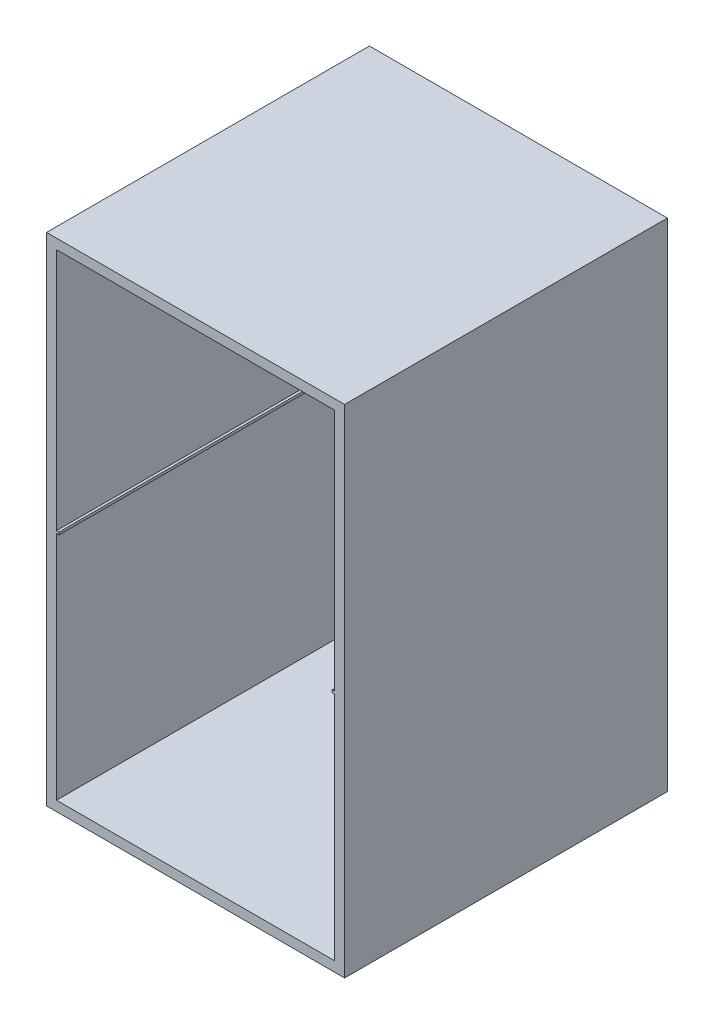
ISO-10303-21;
HEADER;
FILE_DESCRIPTION(('STEP AP214'),'2;1');
FILE_NAME('part.step','',(''),(''),'','','');
FILE_SCHEMA(('AUTOMOTIVE_DESIGN { 1 0 10303 214 1 1 1 1 }'));
ENDSEC;
DATA;
#1=APPLICATION_CONTEXT('core data for automotive mechanical design processes');
#2=APPLICATION_PROTOCOL_DEFINITION('international standard','automotive_design',2000,#1);
#3=PRODUCT_CONTEXT('',#1,'mechanical');
#4=PRODUCT('Part','Part','',(#3));
#5=PRODUCT_RELATED_PRODUCT_CATEGORY('part','',(#4));
#6=PRODUCT_DEFINITION_FORMATION('','',#4);
#7=PRODUCT_DEFINITION_CONTEXT('part definition',#1,'design');
#8=PRODUCT_DEFINITION('design','',#6,#7);
#9=PRODUCT_DEFINITION_SHAPE('','',#8);
#10=(LENGTH_UNIT() NAMED_UNIT(*) SI_UNIT(.MILLI.,.METRE.));
#11=(NAMED_UNIT(*) PLANE_ANGLE_UNIT() SI_UNIT($,.RADIAN.));
#12=(NAMED_UNIT(*) SI_UNIT($,.STERADIAN.) SOLID_ANGLE_UNIT());
#13=UNCERTAINTY_MEASURE_WITH_UNIT(LENGTH_MEASURE(1.E-05),#10,'distance_accuracy_value','');
#14=(GEOMETRIC_REPRESENTATION_CONTEXT(3) GLOBAL_UNCERTAINTY_ASSIGNED_CONTEXT((#13)) GLOBAL_UNIT_ASSIGNED_CONTEXT((#10,
#11,#12)) REPRESENTATION_CONTEXT('',''));
#15=CARTESIAN_POINT('',(0.,0.,0.));
#16=DIRECTION('',(0.,0.,1.));
#17=DIRECTION('',(1.,0.,0.));
#18=AXIS2_PLACEMENT_3D('',#15,#16,#17);
#19=CARTESIAN_POINT('',(280.,-500.,650.));
#20=DIRECTION('',(-1.,0.,0.));
#21=DIRECTION('',(0.,0.,1.));
#22=AXIS2_PLACEMENT_3D('',#19,#20,#21);
#23=PLANE('',#22);
#24=DIRECTION('',(0.,1.,0.));
#25=VECTOR('',#24,1.);
#26=CARTESIAN_POINT('',(280.,-500.,650.));
#27=LINE('',#26,#25);
#28=CARTESIAN_POINT('',(280.,-480.,650.));
#29=VERTEX_POINT('',#28);
#30=CARTESIAN_POINT('',(280.,-15.0000000000001,650.));
#31=VERTEX_POINT('',#30);
#32=EDGE_CURVE('E58',#29,#31,#27,.T.);
#33=ORIENTED_EDGE('',*,*,#32,.T.);
#34=DIRECTION('',(0.,0.,1.));
#35=VECTOR('',#34,1.);
#36=CARTESIAN_POINT('',(280.,-15.,-0.00199999999994649));
#37=LINE('',#36,#35);
#38=CARTESIAN_POINT('',(280.,-15.0000000000001,20.));
#39=VERTEX_POINT('',#38);
#40=EDGE_CURVE('E172',#39,#31,#37,.T.);
#41=ORIENTED_EDGE('',*,*,#40,.F.);
#42=DIRECTION('',(0.,1.,0.));
#43=VECTOR('',#42,1.);
#44=CARTESIAN_POINT('',(280.,-500.,20.));
#45=LINE('',#44,#43);
#46=CARTESIAN_POINT('',(280.,-480.,20.));
#47=VERTEX_POINT('',#46);
#48=EDGE_CURVE('E227',#47,#39,#45,.T.);
#49=ORIENTED_EDGE('',*,*,#48,.F.);
#50=DIRECTION('',(0.,0.,-1.));
#51=VECTOR('',#50,1.);
#52=CARTESIAN_POINT('',(280.,-480.,650.));
#53=LINE('',#52,#51);
#54=EDGE_CURVE('E217',#29,#47,#53,.T.);
#55=ORIENTED_EDGE('',*,*,#54,.F.);
#56=EDGE_LOOP('',(#33,#41,#49,#55));
#57=FACE_BOUND('',#56,.T.);
#58=ADVANCED_FACE('F35',(#57),#23,.T.);
#59=CARTESIAN_POINT('',(0.,0.,20.));
#60=DIRECTION('',(0.,0.,1.));
#61=DIRECTION('',(1.,0.,0.));
#62=AXIS2_PLACEMENT_3D('',#59,#60,#61);
#63=PLANE('',#62);
#64=ORIENTED_EDGE('',*,*,#48,.T.);
#65=DIRECTION('',(1.,0.,0.));
#66=VECTOR('',#65,1.);
#67=CARTESIAN_POINT('',(0.,-15.0000000000002,20.));
#68=LINE('',#67,#66);
#69=CARTESIAN_POINT('',(275.,-15.,20.));
#70=VERTEX_POINT('',#69);
#71=EDGE_CURVE('E155',#70,#39,#68,.T.);
#72=ORIENTED_EDGE('',*,*,#71,.F.);
#73=DIRECTION('',(0.,1.,0.));
#74=VECTOR('',#73,1.);
#75=CARTESIAN_POINT('',(275.,0.,20.));
#76=LINE('',#75,#74);
#77=CARTESIAN_POINT('',(275.,-10.,20.));
#78=VERTEX_POINT('',#77);
#79=EDGE_CURVE('E149',#70,#78,#76,.T.);
#80=ORIENTED_EDGE('',*,*,#79,.T.);
#81=DIRECTION('',(1.,0.,0.));
#82=VECTOR('',#81,1.);
#83=CARTESIAN_POINT('',(0.,-10.0000000000001,20.));
#84=LINE('',#83,#82);
#85=CARTESIAN_POINT('',(280.,-10.0000000000001,20.));
#86=VERTEX_POINT('',#85);
#87=EDGE_CURVE('E153',#78,#86,#84,.T.);
#88=ORIENTED_EDGE('',*,*,#87,.T.);
#89=CARTESIAN_POINT('',(280.,480.,20.));
#90=VERTEX_POINT('',#89);
#91=EDGE_CURVE('E224',#86,#90,#45,.T.);
#92=ORIENTED_EDGE('',*,*,#91,.T.);
#93=DIRECTION('',(-1.,0.,0.));
#94=VECTOR('',#93,1.);
#95=CARTESIAN_POINT('',(300.,480.,20.));
#96=LINE('',#95,#94);
#97=CARTESIAN_POINT('',(-280.,480.,20.));
#98=VERTEX_POINT('',#97);
#99=EDGE_CURVE('E229',#90,#98,#96,.T.);
#100=ORIENTED_EDGE('',*,*,#99,.T.);
#101=DIRECTION('',(0.,-1.,0.));
#102=VECTOR('',#101,1.);
#103=CARTESIAN_POINT('',(-280.,-500.,20.));
#104=LINE('',#103,#102);
#105=CARTESIAN_POINT('',(-280.,-10.0000000000001,20.));
#106=VERTEX_POINT('',#105);
#107=EDGE_CURVE('E209',#98,#106,#104,.T.);
#108=ORIENTED_EDGE('',*,*,#107,.T.);
#109=DIRECTION('',(1.,0.,0.));
#110=VECTOR('',#109,1.);
#111=CARTESIAN_POINT('',(0.,-10.0000000000001,20.));
#112=LINE('',#111,#110);
#113=CARTESIAN_POINT('',(-275.,-10.0000000000001,20.));
#114=VERTEX_POINT('',#113);
#115=EDGE_CURVE('E185',#106,#114,#112,.T.);
#116=ORIENTED_EDGE('',*,*,#115,.T.);
#117=DIRECTION('',(0.,1.,0.));
#118=VECTOR('',#117,1.);
#119=CARTESIAN_POINT('',(-275.,0.,20.));
#120=LINE('',#119,#118);
#121=CARTESIAN_POINT('',(-275.,-15.,20.));
#122=VERTEX_POINT('',#121);
#123=EDGE_CURVE('E182',#122,#114,#120,.T.);
#124=ORIENTED_EDGE('',*,*,#123,.F.);
#125=DIRECTION('',(-1.,0.,0.));
#126=VECTOR('',#125,1.);
#127=CARTESIAN_POINT('',(0.,-15.0000000000002,20.));
#128=LINE('',#127,#126);
#129=CARTESIAN_POINT('',(-280.,-15.,20.));
#130=VERTEX_POINT('',#129);
#131=EDGE_CURVE('E206',#122,#130,#128,.T.);
#132=ORIENTED_EDGE('',*,*,#131,.T.);
#133=CARTESIAN_POINT('',(-280.,-480.,20.));
#134=VERTEX_POINT('',#133);
#135=EDGE_CURVE('E196',#130,#134,#104,.T.);
#136=ORIENTED_EDGE('',*,*,#135,.T.);
#137=DIRECTION('',(1.,0.,0.));
#138=VECTOR('',#137,1.);
#139=CARTESIAN_POINT('',(300.,-480.,20.));
#140=LINE('',#139,#138);
#141=EDGE_CURVE('E212',#134,#47,#140,.T.);
#142=ORIENTED_EDGE('',*,*,#141,.T.);
#143=EDGE_LOOP('',(#64,#72,#80,#88,#92,#100,#108,#116,#124,#132,#136,#142));
#144=FACE_BOUND('',#143,.T.);
#145=ADVANCED_FACE('F152',(#144),#63,.T.);
#146=CARTESIAN_POINT('',(-280.,-500.,650.));
#147=DIRECTION('',(1.,0.,0.));
#148=DIRECTION('',(0.,0.,-1.));
#149=AXIS2_PLACEMENT_3D('',#146,#147,#148);
#150=PLANE('',#149);
#151=DIRECTION('',(0.,0.,1.));
#152=VECTOR('',#151,1.);
#153=CARTESIAN_POINT('',(-280.,-15.,-0.00199999999994649));
#154=LINE('',#153,#152);
#155=CARTESIAN_POINT('',(-280.,-15.,650.));
#156=VERTEX_POINT('',#155);
#157=EDGE_CURVE('E200',#130,#156,#154,.T.);
#158=ORIENTED_EDGE('',*,*,#157,.T.);
#159=DIRECTION('',(0.,-1.,0.));
#160=VECTOR('',#159,1.);
#161=CARTESIAN_POINT('',(-280.,-500.,650.));
#162=LINE('',#161,#160);
#163=CARTESIAN_POINT('',(-280.,-480.,650.));
#164=VERTEX_POINT('',#163);
#165=EDGE_CURVE('E233',#156,#164,#162,.T.);
#166=ORIENTED_EDGE('',*,*,#165,.T.);
#167=DIRECTION('',(0.,0.,-1.));
#168=VECTOR('',#167,1.);
#169=CARTESIAN_POINT('',(-280.,-480.,650.));
#170=LINE('',#169,#168);
#171=EDGE_CURVE('E213',#164,#134,#170,.T.);
#172=ORIENTED_EDGE('',*,*,#171,.T.);
#173=ORIENTED_EDGE('',*,*,#135,.F.);
#174=EDGE_LOOP('',(#158,#166,#172,#173));
#175=FACE_BOUND('',#174,.T.);
#176=ADVANCED_FACE('F292',(#175),#150,.T.);
#177=CARTESIAN_POINT('',(-300.,-500.,650.));
#178=DIRECTION('',(1.,0.,0.));
#179=DIRECTION('',(0.,0.,-1.));
#180=AXIS2_PLACEMENT_3D('',#177,#178,#179);
#181=PLANE('',#180);
#182=DIRECTION('',(0.,-1.,0.));
#183=VECTOR('',#182,1.);
#184=CARTESIAN_POINT('',(-300.,-500.,0.));
#185=LINE('',#184,#183);
#186=CARTESIAN_POINT('',(-300.,500.,0.));
#187=VERTEX_POINT('',#186);
#188=CARTESIAN_POINT('',(-300.,-500.,0.));
#189=VERTEX_POINT('',#188);
#190=EDGE_CURVE('E216',#187,#189,#185,.T.);
#191=ORIENTED_EDGE('',*,*,#190,.T.);
#192=DIRECTION('',(0.,0.,-1.));
#193=VECTOR('',#192,1.);
#194=CARTESIAN_POINT('',(-300.,-500.,650.));
#195=LINE('',#194,#193);
#196=CARTESIAN_POINT('',(-300.,-500.,650.));
#197=VERTEX_POINT('',#196);
#198=EDGE_CURVE('E11',#197,#189,#195,.T.);
#199=ORIENTED_EDGE('',*,*,#198,.F.);
#200=DIRECTION('',(0.,-1.,0.));
#201=VECTOR('',#200,1.);
#202=CARTESIAN_POINT('',(-300.,-500.,650.));
#203=LINE('',#202,#201);
#204=CARTESIAN_POINT('',(-300.,500.,650.));
#205=VERTEX_POINT('',#204);
#206=EDGE_CURVE('E242',#205,#197,#203,.T.);
#207=ORIENTED_EDGE('',*,*,#206,.F.);
#208=DIRECTION('',(0.,0.,-1.));
#209=VECTOR('',#208,1.);
#210=CARTESIAN_POINT('',(-300.,500.,650.));
#211=LINE('',#210,#209);
#212=EDGE_CURVE('E252',#205,#187,#211,.T.);
#213=ORIENTED_EDGE('',*,*,#212,.T.);
#214=EDGE_LOOP('',(#191,#199,#207,#213));
#215=FACE_BOUND('',#214,.T.);
#216=ADVANCED_FACE('F37',(#215),#181,.F.);
#217=CARTESIAN_POINT('',(300.,-500.,650.));
#218=DIRECTION('',(0.,1.,0.));
#219=DIRECTION('',(-1.,0.,0.));
#220=AXIS2_PLACEMENT_3D('',#217,#218,#219);
#221=PLANE('',#220);
#222=DIRECTION('',(1.,0.,0.));
#223=VECTOR('',#222,1.);
#224=CARTESIAN_POINT('',(300.,-500.,0.));
#225=LINE('',#224,#223);
#226=CARTESIAN_POINT('',(300.,-500.,0.));
#227=VERTEX_POINT('',#226);
#228=EDGE_CURVE('E255',#189,#227,#225,.T.);
#229=ORIENTED_EDGE('',*,*,#228,.T.);
#230=DIRECTION('',(0.,0.,-1.));
#231=VECTOR('',#230,1.);
#232=CARTESIAN_POINT('',(300.,-500.,650.));
#233=LINE('',#232,#231);
#234=CARTESIAN_POINT('',(300.,-500.,650.));
#235=VERTEX_POINT('',#234);
#236=EDGE_CURVE('E43',#235,#227,#233,.T.);
#237=ORIENTED_EDGE('',*,*,#236,.F.);
#238=DIRECTION('',(1.,0.,0.));
#239=VECTOR('',#238,1.);
#240=CARTESIAN_POINT('',(300.,-500.,650.));
#241=LINE('',#240,#239);
#242=EDGE_CURVE('E245',#197,#235,#241,.T.);
#243=ORIENTED_EDGE('',*,*,#242,.F.);
#244=ORIENTED_EDGE('',*,*,#198,.T.);
#245=EDGE_LOOP('',(#229,#237,#243,#244));
#246=FACE_BOUND('',#245,.T.);
#247=ADVANCED_FACE('F285',(#246),#221,.F.);
#248=CARTESIAN_POINT('',(300.,-500.,650.));
#249=DIRECTION('',(-1.,0.,0.));
#250=DIRECTION('',(0.,0.,1.));
#251=AXIS2_PLACEMENT_3D('',#248,#249,#250);
#252=PLANE('',#251);
#253=DIRECTION('',(0.,1.,0.));
#254=VECTOR('',#253,1.);
#255=CARTESIAN_POINT('',(300.,-500.,0.));
#256=LINE('',#255,#254);
#257=CARTESIAN_POINT('',(300.,500.,0.));
#258=VERTEX_POINT('',#257);
#259=EDGE_CURVE('E257',#227,#258,#256,.T.);
#260=ORIENTED_EDGE('',*,*,#259,.T.);
#261=DIRECTION('',(0.,0.,-1.));
#262=VECTOR('',#261,1.);
#263=CARTESIAN_POINT('',(300.,500.,650.));
#264=LINE('',#263,#262);
#265=CARTESIAN_POINT('',(300.,500.,650.));
#266=VERTEX_POINT('',#265);
#267=EDGE_CURVE('E262',#266,#258,#264,.T.);
#268=ORIENTED_EDGE('',*,*,#267,.F.);
#269=DIRECTION('',(0.,1.,0.));
#270=VECTOR('',#269,1.);
#271=CARTESIAN_POINT('',(300.,-500.,650.));
#272=LINE('',#271,#270);
#273=EDGE_CURVE('E248',#235,#266,#272,.T.);
#274=ORIENTED_EDGE('',*,*,#273,.F.);
#275=ORIENTED_EDGE('',*,*,#236,.T.);
#276=EDGE_LOOP('',(#260,#268,#274,#275));
#277=FACE_BOUND('',#276,.T.);
#278=ADVANCED_FACE('F269',(#277),#252,.F.);
#279=CARTESIAN_POINT('',(300.,500.,650.));
#280=DIRECTION('',(0.,-1.,0.));
#281=DIRECTION('',(1.,0.,0.));
#282=AXIS2_PLACEMENT_3D('',#279,#280,#281);
#283=PLANE('',#282);
#284=DIRECTION('',(-1.,0.,0.));
#285=VECTOR('',#284,1.);
#286=CARTESIAN_POINT('',(300.,500.,0.));
#287=LINE('',#286,#285);
#288=EDGE_CURVE('E246',#258,#187,#287,.T.);
#289=ORIENTED_EDGE('',*,*,#288,.T.);
#290=ORIENTED_EDGE('',*,*,#212,.F.);
#291=DIRECTION('',(-1.,0.,0.));
#292=VECTOR('',#291,1.);
#293=CARTESIAN_POINT('',(300.,500.,650.));
#294=LINE('',#293,#292);
#295=EDGE_CURVE('E250',#266,#205,#294,.T.);
#296=ORIENTED_EDGE('',*,*,#295,.F.);
#297=ORIENTED_EDGE('',*,*,#267,.T.);
#298=EDGE_LOOP('',(#289,#290,#296,#297));
#299=FACE_BOUND('',#298,.T.);
#300=ADVANCED_FACE('F278',(#299),#283,.F.);
#301=CARTESIAN_POINT('',(0.,0.,650.));
#302=DIRECTION('',(0.,0.,1.));
#303=DIRECTION('',(1.,0.,0.));
#304=AXIS2_PLACEMENT_3D('',#301,#302,#303);
#305=PLANE('',#304);
#306=CARTESIAN_POINT('',(-280.,480.,650.));
#307=VERTEX_POINT('',#306);
#308=CARTESIAN_POINT('',(-280.,-10.0000000000001,650.));
#309=VERTEX_POINT('',#308);
#310=EDGE_CURVE('E234',#307,#309,#162,.T.);
#311=ORIENTED_EDGE('',*,*,#310,.F.);
#312=DIRECTION('',(-1.,0.,0.));
#313=VECTOR('',#312,1.);
#314=CARTESIAN_POINT('',(300.,480.,650.));
#315=LINE('',#314,#313);
#316=CARTESIAN_POINT('',(280.,480.,650.));
#317=VERTEX_POINT('',#316);
#318=EDGE_CURVE('E222',#317,#307,#315,.T.);
#319=ORIENTED_EDGE('',*,*,#318,.F.);
#320=CARTESIAN_POINT('',(280.,-10.,650.));
#321=VERTEX_POINT('',#320);
#322=EDGE_CURVE('E239',#321,#317,#27,.T.);
#323=ORIENTED_EDGE('',*,*,#322,.F.);
#324=DIRECTION('',(-1.,0.,0.));
#325=VECTOR('',#324,1.);
#326=CARTESIAN_POINT('',(0.,-10.0000000000001,650.));
#327=LINE('',#326,#325);
#328=CARTESIAN_POINT('',(275.,-10.,650.));
#329=VERTEX_POINT('',#328);
#330=EDGE_CURVE('E176',#321,#329,#327,.T.);
#331=ORIENTED_EDGE('',*,*,#330,.T.);
#332=DIRECTION('',(0.,-1.,0.));
#333=VECTOR('',#332,1.);
#334=CARTESIAN_POINT('',(275.,0.,650.));
#335=LINE('',#334,#333);
#336=CARTESIAN_POINT('',(275.,-15.,650.));
#337=VERTEX_POINT('',#336);
#338=EDGE_CURVE('E168',#329,#337,#335,.T.);
#339=ORIENTED_EDGE('',*,*,#338,.T.);
#340=DIRECTION('',(-1.,0.,0.));
#341=VECTOR('',#340,1.);
#342=CARTESIAN_POINT('',(0.,-15.0000000000002,650.));
#343=LINE('',#342,#341);
#344=EDGE_CURVE('E180',#31,#337,#343,.T.);
#345=ORIENTED_EDGE('',*,*,#344,.F.);
#346=ORIENTED_EDGE('',*,*,#32,.F.);
#347=DIRECTION('',(1.,0.,0.));
#348=VECTOR('',#347,1.);
#349=CARTESIAN_POINT('',(300.,-480.,650.));
#350=LINE('',#349,#348);
#351=EDGE_CURVE('E237',#164,#29,#350,.T.);
#352=ORIENTED_EDGE('',*,*,#351,.F.);
#353=ORIENTED_EDGE('',*,*,#165,.F.);
#354=DIRECTION('',(1.,0.,0.));
#355=VECTOR('',#354,1.);
#356=CARTESIAN_POINT('',(0.,-15.0000000000002,650.));
#357=LINE('',#356,#355);
#358=CARTESIAN_POINT('',(-275.,-15.,650.));
#359=VERTEX_POINT('',#358);
#360=EDGE_CURVE('E186',#156,#359,#357,.T.);
#361=ORIENTED_EDGE('',*,*,#360,.T.);
#362=DIRECTION('',(0.,-1.,0.));
#363=VECTOR('',#362,1.);
#364=CARTESIAN_POINT('',(-275.,0.,650.));
#365=LINE('',#364,#363);
#366=CARTESIAN_POINT('',(-275.,-10.0000000000001,650.));
#367=VERTEX_POINT('',#366);
#368=EDGE_CURVE('E193',#367,#359,#365,.T.);
#369=ORIENTED_EDGE('',*,*,#368,.F.);
#370=DIRECTION('',(-1.,0.,0.));
#371=VECTOR('',#370,1.);
#372=CARTESIAN_POINT('',(0.,-10.0000000000001,650.));
#373=LINE('',#372,#371);
#374=EDGE_CURVE('E189',#367,#309,#373,.T.);
#375=ORIENTED_EDGE('',*,*,#374,.T.);
#376=EDGE_LOOP('',(#311,#319,#323,#331,#339,#345,#346,#352,#353,#361,#369,#375));
#377=FACE_BOUND('',#376,.T.);
#378=ORIENTED_EDGE('',*,*,#206,.T.);
#379=ORIENTED_EDGE('',*,*,#242,.T.);
#380=ORIENTED_EDGE('',*,*,#273,.T.);
#381=ORIENTED_EDGE('',*,*,#295,.T.);
#382=EDGE_LOOP('',(#378,#379,#380,#381));
#383=FACE_BOUND('',#382,.T.);
#384=ADVANCED_FACE('F284',(#377,#383),#305,.T.);
#385=CARTESIAN_POINT('',(0.,0.,0.));
#386=DIRECTION('',(0.,0.,1.));
#387=DIRECTION('',(1.,0.,0.));
#388=AXIS2_PLACEMENT_3D('',#385,#386,#387);
#389=PLANE('',#388);
#390=ORIENTED_EDGE('',*,*,#190,.F.);
#391=ORIENTED_EDGE('',*,*,#288,.F.);
#392=ORIENTED_EDGE('',*,*,#259,.F.);
#393=ORIENTED_EDGE('',*,*,#228,.F.);
#394=EDGE_LOOP('',(#390,#391,#392,#393));
#395=FACE_BOUND('',#394,.T.);
#396=ADVANCED_FACE('F275',(#395),#389,.F.);
#397=DIRECTION('',(0.,0.,1.));
#398=VECTOR('',#397,1.);
#399=CARTESIAN_POINT('',(-280.,-10.0000000000001,-0.00199999999994649));
#400=LINE('',#399,#398);
#401=EDGE_CURVE('E198',#106,#309,#400,.T.);
#402=ORIENTED_EDGE('',*,*,#401,.F.);
#403=ORIENTED_EDGE('',*,*,#107,.F.);
#404=DIRECTION('',(0.,0.,-1.));
#405=VECTOR('',#404,1.);
#406=CARTESIAN_POINT('',(-280.,480.,650.));
#407=LINE('',#406,#405);
#408=EDGE_CURVE('E218',#307,#98,#407,.T.);
#409=ORIENTED_EDGE('',*,*,#408,.F.);
#410=ORIENTED_EDGE('',*,*,#310,.T.);
#411=EDGE_LOOP('',(#402,#403,#409,#410));
#412=FACE_BOUND('',#411,.T.);
#413=ADVANCED_FACE('F312',(#412),#150,.T.);
#414=CARTESIAN_POINT('',(300.,-480.,650.));
#415=DIRECTION('',(0.,1.,0.));
#416=DIRECTION('',(-1.,0.,0.));
#417=AXIS2_PLACEMENT_3D('',#414,#415,#416);
#418=PLANE('',#417);
#419=ORIENTED_EDGE('',*,*,#141,.F.);
#420=ORIENTED_EDGE('',*,*,#171,.F.);
#421=ORIENTED_EDGE('',*,*,#351,.T.);
#422=ORIENTED_EDGE('',*,*,#54,.T.);
#423=EDGE_LOOP('',(#419,#420,#421,#422));
#424=FACE_BOUND('',#423,.T.);
#425=ADVANCED_FACE('F304',(#424),#418,.T.);
#426=DIRECTION('',(0.,0.,1.));
#427=VECTOR('',#426,1.);
#428=CARTESIAN_POINT('',(280.,-10.,-0.00199999999994649));
#429=LINE('',#428,#427);
#430=EDGE_CURVE('E50',#86,#321,#429,.T.);
#431=ORIENTED_EDGE('',*,*,#430,.T.);
#432=ORIENTED_EDGE('',*,*,#322,.T.);
#433=DIRECTION('',(0.,0.,-1.));
#434=VECTOR('',#433,1.);
#435=CARTESIAN_POINT('',(280.,480.,650.));
#436=LINE('',#435,#434);
#437=EDGE_CURVE('E221',#317,#90,#436,.T.);
#438=ORIENTED_EDGE('',*,*,#437,.T.);
#439=ORIENTED_EDGE('',*,*,#91,.F.);
#440=EDGE_LOOP('',(#431,#432,#438,#439));
#441=FACE_BOUND('',#440,.T.);
#442=ADVANCED_FACE('F295',(#441),#23,.T.);
#443=CARTESIAN_POINT('',(300.,480.,650.));
#444=DIRECTION('',(0.,-1.,0.));
#445=DIRECTION('',(1.,0.,0.));
#446=AXIS2_PLACEMENT_3D('',#443,#444,#445);
#447=PLANE('',#446);
#448=ORIENTED_EDGE('',*,*,#99,.F.);
#449=ORIENTED_EDGE('',*,*,#437,.F.);
#450=ORIENTED_EDGE('',*,*,#318,.T.);
#451=ORIENTED_EDGE('',*,*,#408,.T.);
#452=EDGE_LOOP('',(#448,#449,#450,#451));
#453=FACE_BOUND('',#452,.T.);
#454=ADVANCED_FACE('F303',(#453),#447,.T.);
#455=CARTESIAN_POINT('',(0.,-15.0000000000002,-0.00199999999994649));
#456=DIRECTION('',(0.,-1.,0.));
#457=DIRECTION('',(1.,0.,0.));
#458=AXIS2_PLACEMENT_3D('',#455,#456,#457);
#459=PLANE('',#458);
#460=ORIENTED_EDGE('',*,*,#131,.F.);
#461=DIRECTION('',(0.,0.,1.));
#462=VECTOR('',#461,1.);
#463=CARTESIAN_POINT('',(-275.,-15.,-0.00199999999994649));
#464=LINE('',#463,#462);
#465=EDGE_CURVE('E190',#122,#359,#464,.T.);
#466=ORIENTED_EDGE('',*,*,#465,.T.);
#467=ORIENTED_EDGE('',*,*,#360,.F.);
#468=ORIENTED_EDGE('',*,*,#157,.F.);
#469=EDGE_LOOP('',(#460,#466,#467,#468));
#470=FACE_BOUND('',#469,.T.);
#471=ADVANCED_FACE('F309',(#470),#459,.T.);
#472=CARTESIAN_POINT('',(0.,-10.0000000000001,-0.00199999999994649));
#473=DIRECTION('',(0.,1.,0.));
#474=DIRECTION('',(-1.,0.,0.));
#475=AXIS2_PLACEMENT_3D('',#472,#473,#474);
#476=PLANE('',#475);
#477=ORIENTED_EDGE('',*,*,#115,.F.);
#478=ORIENTED_EDGE('',*,*,#401,.T.);
#479=ORIENTED_EDGE('',*,*,#374,.F.);
#480=DIRECTION('',(0.,0.,1.));
#481=VECTOR('',#480,1.);
#482=CARTESIAN_POINT('',(-275.,-10.0000000000001,-0.00199999999994649));
#483=LINE('',#482,#481);
#484=EDGE_CURVE('E184',#114,#367,#483,.T.);
#485=ORIENTED_EDGE('',*,*,#484,.F.);
#486=EDGE_LOOP('',(#477,#478,#479,#485));
#487=FACE_BOUND('',#486,.T.);
#488=ADVANCED_FACE('F323',(#487),#476,.T.);
#489=CARTESIAN_POINT('',(-275.,0.,-0.00199999999994649));
#490=DIRECTION('',(-1.,0.,0.));
#491=DIRECTION('',(0.,0.,1.));
#492=AXIS2_PLACEMENT_3D('',#489,#490,#491);
#493=PLANE('',#492);
#494=ORIENTED_EDGE('',*,*,#465,.F.);
#495=ORIENTED_EDGE('',*,*,#123,.T.);
#496=ORIENTED_EDGE('',*,*,#484,.T.);
#497=ORIENTED_EDGE('',*,*,#368,.T.);
#498=EDGE_LOOP('',(#494,#495,#496,#497));
#499=FACE_BOUND('',#498,.T.);
#500=ADVANCED_FACE('F311',(#499),#493,.F.);
#501=CARTESIAN_POINT('',(0.,-15.0000000000002,-0.00199999999994649));
#502=DIRECTION('',(0.,1.,0.));
#503=DIRECTION('',(-1.,0.,0.));
#504=AXIS2_PLACEMENT_3D('',#501,#502,#503);
#505=PLANE('',#504);
#506=DIRECTION('',(0.,0.,1.));
#507=VECTOR('',#506,1.);
#508=CARTESIAN_POINT('',(275.,-15.,-0.00199999999994649));
#509=LINE('',#508,#507);
#510=EDGE_CURVE('E170',#70,#337,#509,.T.);
#511=ORIENTED_EDGE('',*,*,#510,.F.);
#512=ORIENTED_EDGE('',*,*,#71,.T.);
#513=ORIENTED_EDGE('',*,*,#40,.T.);
#514=ORIENTED_EDGE('',*,*,#344,.T.);
#515=EDGE_LOOP('',(#511,#512,#513,#514));
#516=FACE_BOUND('',#515,.T.);
#517=ADVANCED_FACE('F327',(#516),#505,.F.);
#518=CARTESIAN_POINT('',(275.,0.,-0.00199999999994649));
#519=DIRECTION('',(-1.,0.,0.));
#520=DIRECTION('',(0.,0.,1.));
#521=AXIS2_PLACEMENT_3D('',#518,#519,#520);
#522=PLANE('',#521);
#523=ORIENTED_EDGE('',*,*,#79,.F.);
#524=ORIENTED_EDGE('',*,*,#510,.T.);
#525=ORIENTED_EDGE('',*,*,#338,.F.);
#526=DIRECTION('',(0.,0.,1.));
#527=VECTOR('',#526,1.);
#528=CARTESIAN_POINT('',(275.,-10.,-0.00199999999994649));
#529=LINE('',#528,#527);
#530=EDGE_CURVE('E163',#78,#329,#529,.T.);
#531=ORIENTED_EDGE('',*,*,#530,.F.);
#532=EDGE_LOOP('',(#523,#524,#525,#531));
#533=FACE_BOUND('',#532,.T.);
#534=ADVANCED_FACE('F166',(#533),#522,.T.);
#535=CARTESIAN_POINT('',(0.,-10.0000000000001,-0.00199999999994649));
#536=DIRECTION('',(0.,1.,0.));
#537=DIRECTION('',(-1.,0.,0.));
#538=AXIS2_PLACEMENT_3D('',#535,#536,#537);
#539=PLANE('',#538);
#540=ORIENTED_EDGE('',*,*,#87,.F.);
#541=ORIENTED_EDGE('',*,*,#530,.T.);
#542=ORIENTED_EDGE('',*,*,#330,.F.);
#543=ORIENTED_EDGE('',*,*,#430,.F.);
#544=EDGE_LOOP('',(#540,#541,#542,#543));
#545=FACE_BOUND('',#544,.T.);
#546=ADVANCED_FACE('F161',(#545),#539,.T.);
#547=CLOSED_SHELL('',(#58,#145,#176,#216,#247,#278,#300,#384,#396,#413,#425,#442,#454,#471,#488,
#500,#517,#534,#546));
#548=MANIFOLD_SOLID_BREP('B2',#547);
#549=ADVANCED_BREP_SHAPE_REPRESENTATION('',(#18,#548),#14);
#550=SHAPE_DEFINITION_REPRESENTATION(#9,#549);
ENDSEC;
END-ISO-10303-21;
